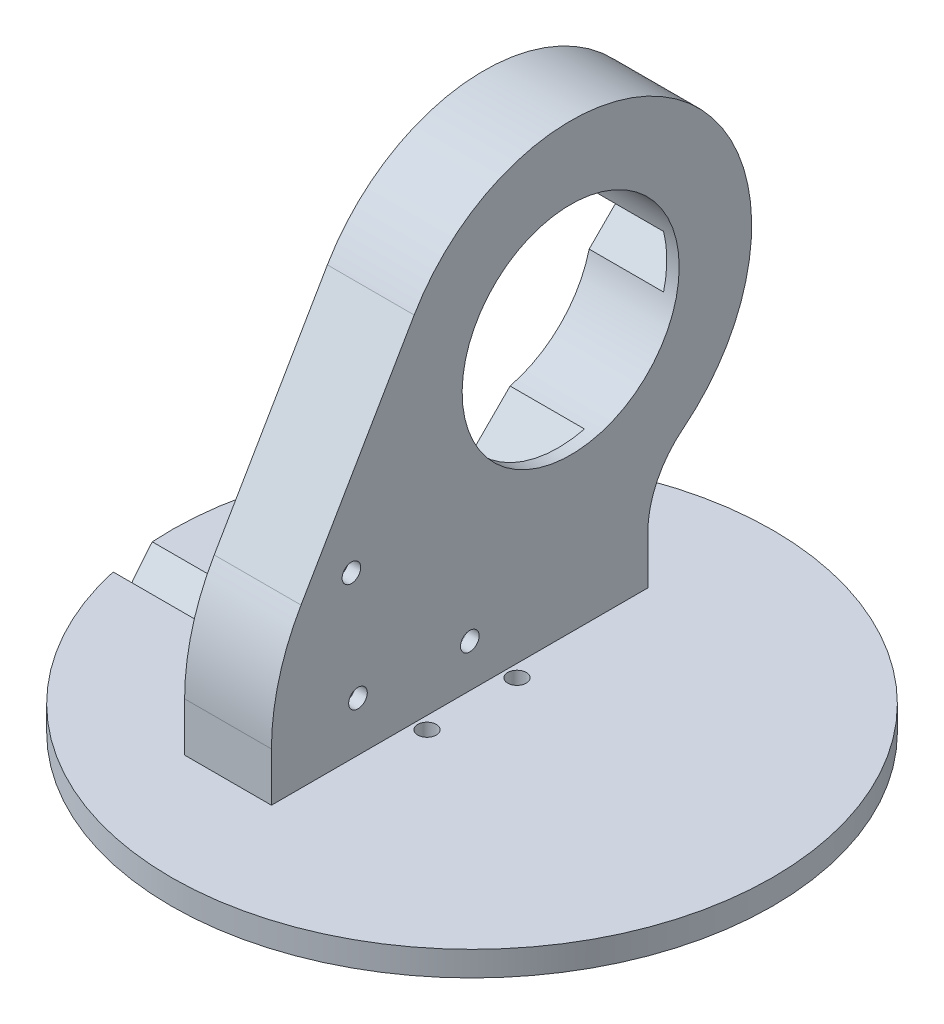
ISO-10303-21;
HEADER;
FILE_DESCRIPTION(('STEP AP214'),'2;1');
FILE_NAME('part.step','',(''),(''),'','','');
FILE_SCHEMA(('AUTOMOTIVE_DESIGN { 1 0 10303 214 1 1 1 1 }'));
ENDSEC;
DATA;
#1=APPLICATION_CONTEXT('core data for automotive mechanical design processes');
#2=APPLICATION_PROTOCOL_DEFINITION('international standard','automotive_design',2000,#1);
#3=PRODUCT_CONTEXT('',#1,'mechanical');
#4=PRODUCT('Part','Part','',(#3));
#5=PRODUCT_RELATED_PRODUCT_CATEGORY('part','',(#4));
#6=PRODUCT_DEFINITION_FORMATION('','',#4);
#7=PRODUCT_DEFINITION_CONTEXT('part definition',#1,'design');
#8=PRODUCT_DEFINITION('design','',#6,#7);
#9=PRODUCT_DEFINITION_SHAPE('','',#8);
#10=(LENGTH_UNIT() NAMED_UNIT(*) SI_UNIT(.MILLI.,.METRE.));
#11=(NAMED_UNIT(*) PLANE_ANGLE_UNIT() SI_UNIT($,.RADIAN.));
#12=(NAMED_UNIT(*) SI_UNIT($,.STERADIAN.) SOLID_ANGLE_UNIT());
#13=UNCERTAINTY_MEASURE_WITH_UNIT(LENGTH_MEASURE(1.E-05),#10,'distance_accuracy_value','');
#14=(GEOMETRIC_REPRESENTATION_CONTEXT(3) GLOBAL_UNCERTAINTY_ASSIGNED_CONTEXT((#13)) GLOBAL_UNIT_ASSIGNED_CONTEXT((#10,
#11,#12)) REPRESENTATION_CONTEXT('',''));
#15=CARTESIAN_POINT('',(0.,0.,0.));
#16=DIRECTION('',(0.,0.,1.));
#17=DIRECTION('',(1.,0.,0.));
#18=AXIS2_PLACEMENT_3D('',#15,#16,#17);
#19=CARTESIAN_POINT('',(0.,4.,0.));
#20=DIRECTION('',(0.,1.,0.));
#21=DIRECTION('',(0.,0.,1.));
#22=AXIS2_PLACEMENT_3D('',#19,#20,#21);
#23=PLANE('',#22);
#24=DIRECTION('',(-1.,0.,0.));
#25=VECTOR('',#24,1.);
#26=CARTESIAN_POINT('',(0.,4.,3.15679656440359));
#27=LINE('',#26,#25);
#28=CARTESIAN_POINT('',(-16.,4.,3.15679656440359));
#29=VERTEX_POINT('',#28);
#30=CARTESIAN_POINT('',(-48.3971552413049,4.,3.15679656440359));
#31=VERTEX_POINT('',#30);
#32=EDGE_CURVE('E236',#29,#31,#27,.T.);
#33=ORIENTED_EDGE('',*,*,#32,.F.);
#34=DIRECTION('',(0.,0.,-1.));
#35=VECTOR('',#34,1.);
#36=CARTESIAN_POINT('',(-16.,4.,30.34));
#37=LINE('',#36,#35);
#38=CARTESIAN_POINT('',(-16.,4.,-30.34));
#39=VERTEX_POINT('',#38);
#40=EDGE_CURVE('E285',#29,#39,#37,.T.);
#41=ORIENTED_EDGE('',*,*,#40,.T.);
#42=DIRECTION('',(-1.,0.,0.));
#43=VECTOR('',#42,1.);
#44=CARTESIAN_POINT('',(-2.,4.,-30.34));
#45=LINE('',#44,#43);
#46=CARTESIAN_POINT('',(-2.,4.,-30.34));
#47=VERTEX_POINT('',#46);
#48=EDGE_CURVE('E272',#47,#39,#45,.T.);
#49=ORIENTED_EDGE('',*,*,#48,.F.);
#50=DIRECTION('',(0.,0.,-1.));
#51=VECTOR('',#50,1.);
#52=CARTESIAN_POINT('',(-2.,4.,30.34));
#53=LINE('',#52,#51);
#54=CARTESIAN_POINT('',(-2.,4.,30.34));
#55=VERTEX_POINT('',#54);
#56=EDGE_CURVE('E270',#55,#47,#53,.T.);
#57=ORIENTED_EDGE('',*,*,#56,.F.);
#58=DIRECTION('',(-1.,0.,0.));
#59=VECTOR('',#58,1.);
#60=CARTESIAN_POINT('',(-2.,4.,30.34));
#61=LINE('',#60,#59);
#62=CARTESIAN_POINT('',(-16.,4.,30.34));
#63=VERTEX_POINT('',#62);
#64=EDGE_CURVE('E286',#55,#63,#61,.T.);
#65=ORIENTED_EDGE('',*,*,#64,.T.);
#66=CARTESIAN_POINT('',(-16.,4.,10.5206781186548));
#67=VERTEX_POINT('',#66);
#68=EDGE_CURVE('E256',#63,#67,#37,.T.);
#69=ORIENTED_EDGE('',*,*,#68,.T.);
#70=DIRECTION('',(1.,0.,0.));
#71=VECTOR('',#70,1.);
#72=CARTESIAN_POINT('',(0.,4.,10.5206781186548));
#73=LINE('',#72,#71);
#74=CARTESIAN_POINT('',(-47.3451722134756,4.,10.5206781186548));
#75=VERTEX_POINT('',#74);
#76=EDGE_CURVE('E241',#75,#67,#73,.T.);
#77=ORIENTED_EDGE('',*,*,#76,.F.);
#78=CARTESIAN_POINT('',(0.,4.,0.));
#79=DIRECTION('',(0.,1.,0.));
#80=DIRECTION('',(0.,0.,1.));
#81=AXIS2_PLACEMENT_3D('',#78,#79,#80);
#82=CIRCLE('',#81,48.5);
#83=EDGE_CURVE('E325',#75,#31,#82,.T.);
#84=ORIENTED_EDGE('',*,*,#83,.T.);
#85=EDGE_LOOP('',(#33,#41,#49,#57,#65,#69,#77,#84));
#86=FACE_BOUND('',#85,.T.);
#87=CARTESIAN_POINT('',(0.,4.,7.25));
#88=DIRECTION('',(0.,1.,0.));
#89=DIRECTION('',(0.,0.,1.));
#90=AXIS2_PLACEMENT_3D('',#87,#88,#89);
#91=CIRCLE('',#90,1.5);
#92=CARTESIAN_POINT('',(0.,4.,8.75));
#93=VERTEX_POINT('',#92);
#94=EDGE_CURVE('E314',#93,#93,#91,.T.);
#95=ORIENTED_EDGE('',*,*,#94,.F.);
#96=EDGE_LOOP('',(#95));
#97=FACE_BOUND('',#96,.T.);
#98=CARTESIAN_POINT('',(0.,4.,-7.25));
#99=DIRECTION('',(0.,1.,0.));
#100=DIRECTION('',(0.,0.,1.));
#101=AXIS2_PLACEMENT_3D('',#98,#99,#100);
#102=CIRCLE('',#101,1.5);
#103=CARTESIAN_POINT('',(0.,4.,-5.75));
#104=VERTEX_POINT('',#103);
#105=EDGE_CURVE('E319',#104,#104,#102,.T.);
#106=ORIENTED_EDGE('',*,*,#105,.F.);
#107=EDGE_LOOP('',(#106));
#108=FACE_BOUND('',#107,.T.);
#109=ADVANCED_FACE('F44',(#86,#97,#108),#23,.T.);
#110=CARTESIAN_POINT('',(0.,4.,-7.25));
#111=DIRECTION('',(0.,-1.,0.));
#112=DIRECTION('',(0.,0.,-1.));
#113=AXIS2_PLACEMENT_3D('',#110,#111,#112);
#114=CYLINDRICAL_SURFACE('',#113,1.5);
#115=ORIENTED_EDGE('',*,*,#105,.T.);
#116=EDGE_LOOP('',(#115));
#117=FACE_BOUND('',#116,.T.);
#118=CARTESIAN_POINT('',(0.,0.,-7.25));
#119=DIRECTION('',(0.,1.,0.));
#120=DIRECTION('',(0.,0.,1.));
#121=AXIS2_PLACEMENT_3D('',#118,#119,#120);
#122=CIRCLE('',#121,1.5);
#123=CARTESIAN_POINT('',(0.,0.,-5.75));
#124=VERTEX_POINT('',#123);
#125=EDGE_CURVE('E327',#124,#124,#122,.T.);
#126=ORIENTED_EDGE('',*,*,#125,.F.);
#127=EDGE_LOOP('',(#126));
#128=FACE_BOUND('',#127,.T.);
#129=ADVANCED_FACE('F464',(#117,#128),#114,.F.);
#130=CARTESIAN_POINT('',(0.,4.,7.25));
#131=DIRECTION('',(0.,-1.,0.));
#132=DIRECTION('',(0.,0.,-1.));
#133=AXIS2_PLACEMENT_3D('',#130,#131,#132);
#134=CYLINDRICAL_SURFACE('',#133,1.5);
#135=ORIENTED_EDGE('',*,*,#94,.T.);
#136=EDGE_LOOP('',(#135));
#137=FACE_BOUND('',#136,.T.);
#138=CARTESIAN_POINT('',(0.,0.,7.25));
#139=DIRECTION('',(0.,1.,0.));
#140=DIRECTION('',(0.,0.,1.));
#141=AXIS2_PLACEMENT_3D('',#138,#139,#140);
#142=CIRCLE('',#141,1.5);
#143=CARTESIAN_POINT('',(0.,0.,8.75));
#144=VERTEX_POINT('',#143);
#145=EDGE_CURVE('E315',#144,#144,#142,.T.);
#146=ORIENTED_EDGE('',*,*,#145,.F.);
#147=EDGE_LOOP('',(#146));
#148=FACE_BOUND('',#147,.T.);
#149=ADVANCED_FACE('F50',(#137,#148),#134,.F.);
#150=CARTESIAN_POINT('',(0.,4.,0.));
#151=DIRECTION('',(0.,-1.,0.));
#152=DIRECTION('',(0.,0.,-1.));
#153=AXIS2_PLACEMENT_3D('',#150,#151,#152);
#154=CYLINDRICAL_SURFACE('',#153,48.5);
#155=CARTESIAN_POINT('',(0.,-6.52067811865472,0.));
#156=DIRECTION('',(0.,-0.707106781186549,0.707106781186546));
#157=DIRECTION('',(0.,-0.707106781186546,-0.707106781186549));
#158=AXIS2_PLACEMENT_3D('',#155,#156,#157);
#159=ELLIPSE('',#158,68.589357775095,48.5);
#160=CARTESIAN_POINT('',(-48.0154315983265,0.318059222874422,6.83873734152916));
#161=VERTEX_POINT('',#160);
#162=EDGE_CURVE('E243',#75,#161,#159,.T.);
#163=ORIENTED_EDGE('',*,*,#162,.T.);
#164=CARTESIAN_POINT('',(0.,7.15679656440359,0.));
#165=DIRECTION('',(0.,-0.707106781186547,-0.707106781186548));
#166=DIRECTION('',(0.,-0.707106781186548,0.707106781186547));
#167=AXIS2_PLACEMENT_3D('',#164,#165,#166);
#168=ELLIPSE('',#167,68.5893577750951,48.5);
#169=EDGE_CURVE('E238',#161,#31,#168,.T.);
#170=ORIENTED_EDGE('',*,*,#169,.T.);
#171=ORIENTED_EDGE('',*,*,#83,.F.);
#172=EDGE_LOOP('',(#163,#170,#171));
#173=FACE_BOUND('',#172,.T.);
#174=CARTESIAN_POINT('',(0.,0.,0.));
#175=DIRECTION('',(0.,1.,0.));
#176=DIRECTION('',(0.,0.,1.));
#177=AXIS2_PLACEMENT_3D('',#174,#175,#176);
#178=CIRCLE('',#177,48.5);
#179=CARTESIAN_POINT('',(0.,0.,48.5));
#180=VERTEX_POINT('',#179);
#181=EDGE_CURVE('E316',#180,#180,#178,.T.);
#182=ORIENTED_EDGE('',*,*,#181,.T.);
#183=EDGE_LOOP('',(#182));
#184=FACE_BOUND('',#183,.T.);
#185=ADVANCED_FACE('F424',(#173,#184),#154,.T.);
#186=CARTESIAN_POINT('',(0.,0.,0.));
#187=DIRECTION('',(0.,1.,0.));
#188=DIRECTION('',(0.,0.,1.));
#189=AXIS2_PLACEMENT_3D('',#186,#187,#188);
#190=PLANE('',#189);
#191=CARTESIAN_POINT('',(0.,0.,0.));
#192=DIRECTION('',(0.,1.,0.));
#193=DIRECTION('',(0.,0.,1.));
#194=AXIS2_PLACEMENT_3D('',#191,#192,#193);
#195=CIRCLE('',#194,3.75);
#196=CARTESIAN_POINT('',(0.,0.,3.75));
#197=VERTEX_POINT('',#196);
#198=EDGE_CURVE('E307',#197,#197,#195,.T.);
#199=ORIENTED_EDGE('',*,*,#198,.T.);
#200=EDGE_LOOP('',(#199));
#201=FACE_BOUND('',#200,.T.);
#202=ORIENTED_EDGE('',*,*,#145,.T.);
#203=EDGE_LOOP('',(#202));
#204=FACE_BOUND('',#203,.T.);
#205=ORIENTED_EDGE('',*,*,#125,.T.);
#206=EDGE_LOOP('',(#205));
#207=FACE_BOUND('',#206,.T.);
#208=ORIENTED_EDGE('',*,*,#181,.F.);
#209=EDGE_LOOP('',(#208));
#210=FACE_BOUND('',#209,.T.);
#211=ADVANCED_FACE('F471',(#201,#204,#207,#210),#190,.F.);
#212=CARTESIAN_POINT('',(0.,0.,0.));
#213=DIRECTION('',(0.,1.,0.));
#214=DIRECTION('',(0.,0.,1.));
#215=AXIS2_PLACEMENT_3D('',#212,#213,#214);
#216=CYLINDRICAL_SURFACE('',#215,3.75);
#217=ORIENTED_EDGE('',*,*,#198,.F.);
#218=EDGE_LOOP('',(#217));
#219=FACE_BOUND('',#218,.T.);
#220=CARTESIAN_POINT('',(0.,1.5,0.));
#221=DIRECTION('',(0.,1.,0.));
#222=DIRECTION('',(0.,0.,1.));
#223=AXIS2_PLACEMENT_3D('',#220,#221,#222);
#224=CIRCLE('',#223,3.75);
#225=CARTESIAN_POINT('',(0.,1.5,3.75));
#226=VERTEX_POINT('',#225);
#227=EDGE_CURVE('E308',#226,#226,#224,.T.);
#228=ORIENTED_EDGE('',*,*,#227,.T.);
#229=EDGE_LOOP('',(#228));
#230=FACE_BOUND('',#229,.T.);
#231=ADVANCED_FACE('F475',(#219,#230),#216,.F.);
#232=CARTESIAN_POINT('',(0.,1.5,0.));
#233=DIRECTION('',(0.,1.,0.));
#234=DIRECTION('',(0.,0.,1.));
#235=AXIS2_PLACEMENT_3D('',#232,#233,#234);
#236=PLANE('',#235);
#237=ORIENTED_EDGE('',*,*,#227,.F.);
#238=EDGE_LOOP('',(#237));
#239=FACE_BOUND('',#238,.T.);
#240=ADVANCED_FACE('F509',(#239),#236,.F.);
#241=CARTESIAN_POINT('',(-2.,11.64,-45.34));
#242=DIRECTION('',(-1.,0.,0.));
#243=DIRECTION('',(0.,0.,1.));
#244=AXIS2_PLACEMENT_3D('',#241,#242,#243);
#245=PLANE('',#244);
#246=CARTESIAN_POINT('',(-2.,10.9246609406724,-1.64654403270961));
#247=DIRECTION('',(-1.,0.,0.));
#248=DIRECTION('',(0.,0.,1.));
#249=AXIS2_PLACEMENT_3D('',#246,#247,#248);
#250=CIRCLE('',#249,1.49999999999989);
#251=CARTESIAN_POINT('',(-2.,10.9246609406724,-0.146544032709713));
#252=VERTEX_POINT('',#251);
#253=EDGE_CURVE('E431',#252,#252,#250,.T.);
#254=ORIENTED_EDGE('',*,*,#253,.T.);
#255=EDGE_LOOP('',(#254));
#256=FACE_BOUND('',#255,.T.);
#257=CARTESIAN_POINT('',(-2.,11.9853211124524,16.3846788875475));
#258=DIRECTION('',(-1.,0.,0.));
#259=DIRECTION('',(0.,0.,1.));
#260=AXIS2_PLACEMENT_3D('',#257,#258,#259);
#261=CIRCLE('',#260,1.49999999999997);
#262=CARTESIAN_POINT('',(-2.,11.9853211124524,17.8846788875475));
#263=VERTEX_POINT('',#262);
#264=EDGE_CURVE('E435',#263,#263,#261,.T.);
#265=ORIENTED_EDGE('',*,*,#264,.T.);
#266=EDGE_LOOP('',(#265));
#267=FACE_BOUND('',#266,.T.);
#268=CARTESIAN_POINT('',(-2.,30.0165440327093,17.4453390593273));
#269=DIRECTION('',(-1.,0.,0.));
#270=DIRECTION('',(0.,0.,1.));
#271=AXIS2_PLACEMENT_3D('',#268,#269,#270);
#272=CIRCLE('',#271,1.5);
#273=CARTESIAN_POINT('',(-2.,30.0165440327093,18.9453390593273));
#274=VERTEX_POINT('',#273);
#275=EDGE_CURVE('E202',#274,#274,#272,.T.);
#276=ORIENTED_EDGE('',*,*,#275,.T.);
#277=EDGE_LOOP('',(#276));
#278=FACE_BOUND('',#277,.T.);
#279=DIRECTION('',(0.,1.,0.));
#280=VECTOR('',#279,1.);
#281=CARTESIAN_POINT('',(-2.,4.,-30.34));
#282=LINE('',#281,#280);
#283=CARTESIAN_POINT('',(-2.,11.64,-30.34));
#284=VERTEX_POINT('',#283);
#285=EDGE_CURVE('E253',#47,#284,#282,.T.);
#286=ORIENTED_EDGE('',*,*,#285,.T.);
#287=CARTESIAN_POINT('',(-2.,11.64,-45.34));
#288=DIRECTION('',(-1.,0.,0.));
#289=DIRECTION('',(0.,0.,1.));
#290=AXIS2_PLACEMENT_3D('',#287,#288,#289);
#291=CIRCLE('',#290,15.);
#292=CARTESIAN_POINT('',(-2.,23.3995858768625,-36.0280646477385));
#293=VERTEX_POINT('',#292);
#294=EDGE_CURVE('E259',#284,#293,#291,.T.);
#295=ORIENTED_EDGE('',*,*,#294,.T.);
#296=CARTESIAN_POINT('',(-2.,46.28,-17.91));
#297=DIRECTION('',(1.,0.,0.));
#298=DIRECTION('',(0.,0.,-1.));
#299=AXIS2_PLACEMENT_3D('',#296,#297,#298);
#300=CIRCLE('',#299,29.1852294324699);
#301=CARTESIAN_POINT('',(-2.,60.9494116973824,7.32065551028364));
#302=VERTEX_POINT('',#301);
#303=EDGE_CURVE('E261',#293,#302,#300,.T.);
#304=ORIENTED_EDGE('',*,*,#303,.T.);
#305=DIRECTION('',(0.,-0.864500845150575,0.502631364653998));
#306=VECTOR('',#305,1.);
#307=CARTESIAN_POINT('',(-2.,29.5677029767604,25.5663647746548));
#308=LINE('',#307,#306);
#309=CARTESIAN_POINT('',(-2.,29.5677029767604,25.5663647746548));
#310=VERTEX_POINT('',#309);
#311=EDGE_CURVE('E264',#302,#310,#308,.T.);
#312=ORIENTED_EDGE('',*,*,#311,.T.);
#313=CARTESIAN_POINT('',(-2.,11.86,-4.89));
#314=DIRECTION('',(1.,0.,0.));
#315=DIRECTION('',(0.,0.,1.));
#316=AXIS2_PLACEMENT_3D('',#313,#314,#315);
#317=CIRCLE('',#316,35.23);
#318=CARTESIAN_POINT('',(-2.,11.86,30.34));
#319=VERTEX_POINT('',#318);
#320=EDGE_CURVE('E265',#310,#319,#317,.T.);
#321=ORIENTED_EDGE('',*,*,#320,.T.);
#322=DIRECTION('',(0.,-1.,0.));
#323=VECTOR('',#322,1.);
#324=CARTESIAN_POINT('',(-2.,4.,30.34));
#325=LINE('',#324,#323);
#326=EDGE_CURVE('E269',#319,#55,#325,.T.);
#327=ORIENTED_EDGE('',*,*,#326,.T.);
#328=ORIENTED_EDGE('',*,*,#56,.T.);
#329=EDGE_LOOP('',(#286,#295,#304,#312,#321,#327,#328));
#330=FACE_BOUND('',#329,.T.);
#331=CARTESIAN_POINT('',(-2.,46.28,-17.91));
#332=DIRECTION('',(1.,0.,0.));
#333=DIRECTION('',(0.,0.,-1.));
#334=AXIS2_PLACEMENT_3D('',#331,#332,#333);
#335=CIRCLE('',#334,17.5);
#336=CARTESIAN_POINT('',(-2.,46.28,-35.41));
#337=VERTEX_POINT('',#336);
#338=EDGE_CURVE('E250',#337,#337,#335,.T.);
#339=ORIENTED_EDGE('',*,*,#338,.F.);
#340=EDGE_LOOP('',(#339));
#341=FACE_BOUND('',#340,.T.);
#342=ADVANCED_FACE('F443',(#256,#267,#278,#330,#341),#245,.F.);
#343=CARTESIAN_POINT('',(-16.,11.64,-45.34));
#344=DIRECTION('',(-1.,0.,0.));
#345=DIRECTION('',(0.,0.,1.));
#346=AXIS2_PLACEMENT_3D('',#343,#344,#345);
#347=PLANE('',#346);
#348=DIRECTION('',(0.,-0.707106781186548,0.707106781186547));
#349=VECTOR('',#348,1.);
#350=CARTESIAN_POINT('',(-16.,32.0683982822018,-24.9116017177982));
#351=LINE('',#350,#349);
#352=CARTESIAN_POINT('',(-16.,29.2996238902108,-22.1428273258072));
#353=VERTEX_POINT('',#352);
#354=EDGE_CURVE('E232',#353,#29,#351,.T.);
#355=ORIENTED_EDGE('',*,*,#354,.F.);
#356=CARTESIAN_POINT('',(-16.,46.28,-17.91));
#357=DIRECTION('',(1.,0.,0.));
#358=DIRECTION('',(0.,0.,-1.));
#359=AXIS2_PLACEMENT_3D('',#356,#357,#358);
#360=CIRCLE('',#359,17.5);
#361=CARTESIAN_POINT('',(-16.,42.0471726741928,-34.8903761097892));
#362=VERTEX_POINT('',#361);
#363=EDGE_CURVE('E246',#353,#362,#360,.T.);
#364=ORIENTED_EDGE('',*,*,#363,.T.);
#365=CARTESIAN_POINT('',(-16.,46.28,-39.1232034355964));
#366=VERTEX_POINT('',#365);
#367=EDGE_CURVE('E231',#366,#362,#351,.T.);
#368=ORIENTED_EDGE('',*,*,#367,.F.);
#369=DIRECTION('',(0.,-0.707106781186547,-0.707106781186548));
#370=VECTOR('',#369,1.);
#371=CARTESIAN_POINT('',(-16.,25.8516017177982,-59.5516017177982));
#372=LINE('',#371,#370);
#373=CARTESIAN_POINT('',(-16.,50.5128273258072,-34.8903761097892));
#374=VERTEX_POINT('',#373);
#375=EDGE_CURVE('E186',#374,#366,#372,.T.);
#376=ORIENTED_EDGE('',*,*,#375,.F.);
#377=CARTESIAN_POINT('',(-16.,63.2603761097892,-22.1428273258072));
#378=VERTEX_POINT('',#377);
#379=EDGE_CURVE('E252',#374,#378,#360,.T.);
#380=ORIENTED_EDGE('',*,*,#379,.T.);
#381=CARTESIAN_POINT('',(-16.,67.4932034355964,-17.91));
#382=VERTEX_POINT('',#381);
#383=EDGE_CURVE('E225',#382,#378,#372,.T.);
#384=ORIENTED_EDGE('',*,*,#383,.F.);
#385=DIRECTION('',(0.,0.707106781186548,-0.707106781186548));
#386=VECTOR('',#385,1.);
#387=CARTESIAN_POINT('',(-16.,53.2816017177982,-3.69839828220178));
#388=LINE('',#387,#386);
#389=CARTESIAN_POINT('',(-16.,63.2603761097892,-13.6771726741928));
#390=VERTEX_POINT('',#389);
#391=EDGE_CURVE('E235',#390,#382,#388,.T.);
#392=ORIENTED_EDGE('',*,*,#391,.F.);
#393=CARTESIAN_POINT('',(-16.,50.5128273258072,-0.929623890210798));
#394=VERTEX_POINT('',#393);
#395=EDGE_CURVE('E251',#390,#394,#360,.T.);
#396=ORIENTED_EDGE('',*,*,#395,.T.);
#397=CARTESIAN_POINT('',(-16.,21.5312626584708,28.0519407771256));
#398=VERTEX_POINT('',#397);
#399=EDGE_CURVE('E229',#398,#394,#388,.T.);
#400=ORIENTED_EDGE('',*,*,#399,.F.);
#401=DIRECTION('',(0.,0.707106781186546,0.707106781186549));
#402=VECTOR('',#401,1.);
#403=CARTESIAN_POINT('',(-16.,-20.1103390593274,-13.5896609406727));
#404=LINE('',#403,#402);
#405=EDGE_CURVE('E11',#67,#398,#404,.T.);
#406=ORIENTED_EDGE('',*,*,#405,.F.);
#407=ORIENTED_EDGE('',*,*,#68,.F.);
#408=DIRECTION('',(0.,-1.,0.));
#409=VECTOR('',#408,1.);
#410=CARTESIAN_POINT('',(-16.,4.,30.34));
#411=LINE('',#410,#409);
#412=CARTESIAN_POINT('',(-16.,11.86,30.34));
#413=VERTEX_POINT('',#412);
#414=EDGE_CURVE('E282',#413,#63,#411,.T.);
#415=ORIENTED_EDGE('',*,*,#414,.F.);
#416=CARTESIAN_POINT('',(-16.,11.86,-4.89));
#417=DIRECTION('',(1.,0.,0.));
#418=DIRECTION('',(0.,0.,1.));
#419=AXIS2_PLACEMENT_3D('',#416,#417,#418);
#420=CIRCLE('',#419,35.23);
#421=CARTESIAN_POINT('',(-16.,29.5677029767604,25.5663647746548));
#422=VERTEX_POINT('',#421);
#423=EDGE_CURVE('E278',#422,#413,#420,.T.);
#424=ORIENTED_EDGE('',*,*,#423,.F.);
#425=DIRECTION('',(0.,-0.864500845150575,0.502631364653998));
#426=VECTOR('',#425,1.);
#427=CARTESIAN_POINT('',(-16.,29.5677029767604,25.5663647746548));
#428=LINE('',#427,#426);
#429=CARTESIAN_POINT('',(-16.,60.9494116973824,7.32065551028364));
#430=VERTEX_POINT('',#429);
#431=EDGE_CURVE('E279',#430,#422,#428,.T.);
#432=ORIENTED_EDGE('',*,*,#431,.F.);
#433=CARTESIAN_POINT('',(-16.,46.28,-17.91));
#434=DIRECTION('',(1.,0.,0.));
#435=DIRECTION('',(0.,0.,-1.));
#436=AXIS2_PLACEMENT_3D('',#433,#434,#435);
#437=CIRCLE('',#436,29.1852294324699);
#438=CARTESIAN_POINT('',(-16.,23.3995858768625,-36.0280646477385));
#439=VERTEX_POINT('',#438);
#440=EDGE_CURVE('E277',#439,#430,#437,.T.);
#441=ORIENTED_EDGE('',*,*,#440,.F.);
#442=CARTESIAN_POINT('',(-16.,11.64,-45.34));
#443=DIRECTION('',(-1.,0.,0.));
#444=DIRECTION('',(0.,0.,1.));
#445=AXIS2_PLACEMENT_3D('',#442,#443,#444);
#446=CIRCLE('',#445,15.);
#447=CARTESIAN_POINT('',(-16.,11.64,-30.34));
#448=VERTEX_POINT('',#447);
#449=EDGE_CURVE('E274',#448,#439,#446,.T.);
#450=ORIENTED_EDGE('',*,*,#449,.F.);
#451=DIRECTION('',(0.,1.,0.));
#452=VECTOR('',#451,1.);
#453=CARTESIAN_POINT('',(-16.,4.,-30.34));
#454=LINE('',#453,#452);
#455=EDGE_CURVE('E249',#39,#448,#454,.T.);
#456=ORIENTED_EDGE('',*,*,#455,.F.);
#457=ORIENTED_EDGE('',*,*,#40,.F.);
#458=EDGE_LOOP('',(#355,#364,#368,#376,#380,#384,#392,#396,#400,#406,#407,#415,#424,#432,#441,
#450,#456,#457));
#459=FACE_BOUND('',#458,.T.);
#460=ADVANCED_FACE('F356',(#459),#347,.T.);
#461=CARTESIAN_POINT('',(-2.,4.,-30.34));
#462=DIRECTION('',(0.,0.,1.));
#463=DIRECTION('',(1.,0.,0.));
#464=AXIS2_PLACEMENT_3D('',#461,#462,#463);
#465=PLANE('',#464);
#466=ORIENTED_EDGE('',*,*,#455,.T.);
#467=DIRECTION('',(-1.,0.,0.));
#468=VECTOR('',#467,1.);
#469=CARTESIAN_POINT('',(-2.,11.64,-30.34));
#470=LINE('',#469,#468);
#471=EDGE_CURVE('E304',#284,#448,#470,.T.);
#472=ORIENTED_EDGE('',*,*,#471,.F.);
#473=ORIENTED_EDGE('',*,*,#285,.F.);
#474=ORIENTED_EDGE('',*,*,#48,.T.);
#475=EDGE_LOOP('',(#466,#472,#473,#474));
#476=FACE_BOUND('',#475,.T.);
#477=ADVANCED_FACE('F416',(#476),#465,.F.);
#478=CARTESIAN_POINT('',(-2.,11.64,-45.34));
#479=DIRECTION('',(-1.,0.,0.));
#480=DIRECTION('',(0.,0.,1.));
#481=AXIS2_PLACEMENT_3D('',#478,#479,#480);
#482=CYLINDRICAL_SURFACE('',#481,15.);
#483=ORIENTED_EDGE('',*,*,#449,.T.);
#484=DIRECTION('',(-1.,0.,0.));
#485=VECTOR('',#484,1.);
#486=CARTESIAN_POINT('',(-2.,23.3995858768625,-36.0280646477385));
#487=LINE('',#486,#485);
#488=EDGE_CURVE('E305',#293,#439,#487,.T.);
#489=ORIENTED_EDGE('',*,*,#488,.F.);
#490=ORIENTED_EDGE('',*,*,#294,.F.);
#491=ORIENTED_EDGE('',*,*,#471,.T.);
#492=EDGE_LOOP('',(#483,#489,#490,#491));
#493=FACE_BOUND('',#492,.T.);
#494=ADVANCED_FACE('F419',(#493),#482,.F.);
#495=CARTESIAN_POINT('',(-2.,46.28,-17.91));
#496=DIRECTION('',(-1.,0.,0.));
#497=DIRECTION('',(0.,0.,1.));
#498=AXIS2_PLACEMENT_3D('',#495,#496,#497);
#499=CYLINDRICAL_SURFACE('',#498,29.1852294324699);
#500=ORIENTED_EDGE('',*,*,#440,.T.);
#501=DIRECTION('',(-1.,0.,0.));
#502=VECTOR('',#501,1.);
#503=CARTESIAN_POINT('',(-2.,60.9494116973824,7.32065551028364));
#504=LINE('',#503,#502);
#505=EDGE_CURVE('E299',#302,#430,#504,.T.);
#506=ORIENTED_EDGE('',*,*,#505,.F.);
#507=ORIENTED_EDGE('',*,*,#303,.F.);
#508=ORIENTED_EDGE('',*,*,#488,.T.);
#509=EDGE_LOOP('',(#500,#506,#507,#508));
#510=FACE_BOUND('',#509,.T.);
#511=ADVANCED_FACE('F412',(#510),#499,.T.);
#512=CARTESIAN_POINT('',(-2.,29.5677029767604,25.5663647746548));
#513=DIRECTION('',(0.,-0.502631364653998,-0.864500845150575));
#514=DIRECTION('',(0.,0.864500845150575,-0.502631364653998));
#515=AXIS2_PLACEMENT_3D('',#512,#513,#514);
#516=PLANE('',#515);
#517=ORIENTED_EDGE('',*,*,#431,.T.);
#518=DIRECTION('',(-1.,0.,0.));
#519=VECTOR('',#518,1.);
#520=CARTESIAN_POINT('',(-2.,29.5677029767604,25.5663647746548));
#521=LINE('',#520,#519);
#522=EDGE_CURVE('E298',#310,#422,#521,.T.);
#523=ORIENTED_EDGE('',*,*,#522,.F.);
#524=ORIENTED_EDGE('',*,*,#311,.F.);
#525=ORIENTED_EDGE('',*,*,#505,.T.);
#526=EDGE_LOOP('',(#517,#523,#524,#525));
#527=FACE_BOUND('',#526,.T.);
#528=ADVANCED_FACE('F409',(#527),#516,.F.);
#529=CARTESIAN_POINT('',(-2.,11.86,-4.89));
#530=DIRECTION('',(-1.,0.,0.));
#531=DIRECTION('',(0.,0.,1.));
#532=AXIS2_PLACEMENT_3D('',#529,#530,#531);
#533=CYLINDRICAL_SURFACE('',#532,35.23);
#534=ORIENTED_EDGE('',*,*,#423,.T.);
#535=DIRECTION('',(-1.,0.,0.));
#536=VECTOR('',#535,1.);
#537=CARTESIAN_POINT('',(-2.,11.86,30.34));
#538=LINE('',#537,#536);
#539=EDGE_CURVE('E291',#319,#413,#538,.T.);
#540=ORIENTED_EDGE('',*,*,#539,.F.);
#541=ORIENTED_EDGE('',*,*,#320,.F.);
#542=ORIENTED_EDGE('',*,*,#522,.T.);
#543=EDGE_LOOP('',(#534,#540,#541,#542));
#544=FACE_BOUND('',#543,.T.);
#545=ADVANCED_FACE('F401',(#544),#533,.T.);
#546=CARTESIAN_POINT('',(-2.,4.,30.34));
#547=DIRECTION('',(0.,0.,-1.));
#548=DIRECTION('',(-1.,0.,0.));
#549=AXIS2_PLACEMENT_3D('',#546,#547,#548);
#550=PLANE('',#549);
#551=ORIENTED_EDGE('',*,*,#414,.T.);
#552=ORIENTED_EDGE('',*,*,#64,.F.);
#553=ORIENTED_EDGE('',*,*,#326,.F.);
#554=ORIENTED_EDGE('',*,*,#539,.T.);
#555=EDGE_LOOP('',(#551,#552,#553,#554));
#556=FACE_BOUND('',#555,.T.);
#557=ADVANCED_FACE('F399',(#556),#550,.F.);
#558=CARTESIAN_POINT('',(-2.,46.28,-17.91));
#559=DIRECTION('',(-1.,0.,0.));
#560=DIRECTION('',(0.,0.,1.));
#561=AXIS2_PLACEMENT_3D('',#558,#559,#560);
#562=CYLINDRICAL_SURFACE('',#561,17.5);
#563=DIRECTION('',(-1.,0.,0.));
#564=VECTOR('',#563,1.);
#565=CARTESIAN_POINT('',(-2.,63.2603761097892,-13.6771726741928));
#566=LINE('',#565,#564);
#567=CARTESIAN_POINT('',(-4.,63.2603761097892,-13.6771726741928));
#568=VERTEX_POINT('',#567);
#569=EDGE_CURVE('E52',#568,#390,#566,.T.);
#570=ORIENTED_EDGE('',*,*,#569,.F.);
#571=CARTESIAN_POINT('',(-4.,46.28,-17.91));
#572=DIRECTION('',(1.,0.,0.));
#573=DIRECTION('',(0.,0.,-1.));
#574=AXIS2_PLACEMENT_3D('',#571,#572,#573);
#575=CIRCLE('',#574,17.5);
#576=CARTESIAN_POINT('',(-4.,63.2603761097892,-22.1428273258072));
#577=VERTEX_POINT('',#576);
#578=EDGE_CURVE('E335',#577,#568,#575,.T.);
#579=ORIENTED_EDGE('',*,*,#578,.F.);
#580=DIRECTION('',(-1.,0.,0.));
#581=VECTOR('',#580,1.);
#582=CARTESIAN_POINT('',(-2.,63.2603761097892,-22.1428273258072));
#583=LINE('',#582,#581);
#584=EDGE_CURVE('E344',#378,#577,#583,.F.);
#585=ORIENTED_EDGE('',*,*,#584,.F.);
#586=ORIENTED_EDGE('',*,*,#379,.F.);
#587=DIRECTION('',(-1.,0.,0.));
#588=VECTOR('',#587,1.);
#589=CARTESIAN_POINT('',(-2.,50.5128273258072,-34.8903761097892));
#590=LINE('',#589,#588);
#591=CARTESIAN_POINT('',(-4.,50.5128273258072,-34.8903761097892));
#592=VERTEX_POINT('',#591);
#593=EDGE_CURVE('E332',#592,#374,#590,.T.);
#594=ORIENTED_EDGE('',*,*,#593,.F.);
#595=CARTESIAN_POINT('',(-4.,42.0471726741928,-34.8903761097892));
#596=VERTEX_POINT('',#595);
#597=EDGE_CURVE('E210',#596,#592,#575,.T.);
#598=ORIENTED_EDGE('',*,*,#597,.F.);
#599=DIRECTION('',(-1.,0.,0.));
#600=VECTOR('',#599,1.);
#601=CARTESIAN_POINT('',(-2.,42.0471726741928,-34.8903761097892));
#602=LINE('',#601,#600);
#603=EDGE_CURVE('E198',#362,#596,#602,.F.);
#604=ORIENTED_EDGE('',*,*,#603,.F.);
#605=ORIENTED_EDGE('',*,*,#363,.F.);
#606=DIRECTION('',(-1.,0.,0.));
#607=VECTOR('',#606,1.);
#608=CARTESIAN_POINT('',(-2.,29.2996238902108,-22.1428273258072));
#609=LINE('',#608,#607);
#610=CARTESIAN_POINT('',(-4.,29.2996238902108,-22.1428273258072));
#611=VERTEX_POINT('',#610);
#612=EDGE_CURVE('E342',#611,#353,#609,.T.);
#613=ORIENTED_EDGE('',*,*,#612,.F.);
#614=CARTESIAN_POINT('',(-4.,50.5128273258072,-0.929623890210797));
#615=VERTEX_POINT('',#614);
#616=EDGE_CURVE('E331',#615,#611,#575,.T.);
#617=ORIENTED_EDGE('',*,*,#616,.F.);
#618=DIRECTION('',(-1.,0.,0.));
#619=VECTOR('',#618,1.);
#620=CARTESIAN_POINT('',(-2.,50.5128273258072,-0.929623890210798));
#621=LINE('',#620,#619);
#622=EDGE_CURVE('E336',#394,#615,#621,.F.);
#623=ORIENTED_EDGE('',*,*,#622,.F.);
#624=ORIENTED_EDGE('',*,*,#395,.F.);
#625=EDGE_LOOP('',(#570,#579,#585,#586,#594,#598,#604,#605,#613,#617,#623,#624));
#626=FACE_BOUND('',#625,.T.);
#627=ORIENTED_EDGE('',*,*,#338,.T.);
#628=EDGE_LOOP('',(#627));
#629=FACE_BOUND('',#628,.T.);
#630=ADVANCED_FACE('F363',(#626,#629),#562,.F.);
#631=CARTESIAN_POINT('',(-4.,0.,0.));
#632=DIRECTION('',(1.,0.,0.));
#633=DIRECTION('',(0.,0.,-1.));
#634=AXIS2_PLACEMENT_3D('',#631,#632,#633);
#635=PLANE('',#634);
#636=ORIENTED_EDGE('',*,*,#597,.T.);
#637=DIRECTION('',(0.,0.707106781186547,0.707106781186548));
#638=VECTOR('',#637,1.);
#639=CARTESIAN_POINT('',(-4.,42.7016017177982,-42.7016017177982));
#640=LINE('',#639,#638);
#641=CARTESIAN_POINT('',(-4.,46.28,-39.1232034355964));
#642=VERTEX_POINT('',#641);
#643=EDGE_CURVE('E187',#642,#592,#640,.T.);
#644=ORIENTED_EDGE('',*,*,#643,.F.);
#645=DIRECTION('',(0.,0.707106781186548,-0.707106781186547));
#646=VECTOR('',#645,1.);
#647=CARTESIAN_POINT('',(-4.,3.57839828220179,3.5783982822018));
#648=LINE('',#647,#646);
#649=EDGE_CURVE('E196',#596,#642,#648,.T.);
#650=ORIENTED_EDGE('',*,*,#649,.F.);
#651=EDGE_LOOP('',(#636,#644,#650));
#652=FACE_BOUND('',#651,.T.);
#653=ADVANCED_FACE('F207',(#652),#635,.F.);
#654=CARTESIAN_POINT('',(-48.5,42.7016017177982,-42.7016017177982));
#655=DIRECTION('',(0.,0.707106781186548,-0.707106781186547));
#656=DIRECTION('',(0.,0.707106781186547,0.707106781186548));
#657=AXIS2_PLACEMENT_3D('',#654,#655,#656);
#658=PLANE('',#657);
#659=ORIENTED_EDGE('',*,*,#375,.T.);
#660=DIRECTION('',(1.,0.,0.));
#661=VECTOR('',#660,1.);
#662=CARTESIAN_POINT('',(-48.5,46.28,-39.1232034355964));
#663=LINE('',#662,#661);
#664=EDGE_CURVE('E185',#366,#642,#663,.T.);
#665=ORIENTED_EDGE('',*,*,#664,.T.);
#666=ORIENTED_EDGE('',*,*,#643,.T.);
#667=ORIENTED_EDGE('',*,*,#593,.T.);
#668=EDGE_LOOP('',(#659,#665,#666,#667));
#669=FACE_BOUND('',#668,.T.);
#670=ADVANCED_FACE('F183',(#669),#658,.F.);
#671=CARTESIAN_POINT('',(-48.5,3.57839828220179,3.5783982822018));
#672=DIRECTION('',(0.,-0.707106781186547,-0.707106781186548));
#673=DIRECTION('',(0.,0.707106781186548,-0.707106781186547));
#674=AXIS2_PLACEMENT_3D('',#671,#672,#673);
#675=PLANE('',#674);
#676=ORIENTED_EDGE('',*,*,#367,.T.);
#677=ORIENTED_EDGE('',*,*,#603,.T.);
#678=ORIENTED_EDGE('',*,*,#649,.T.);
#679=ORIENTED_EDGE('',*,*,#664,.F.);
#680=EDGE_LOOP('',(#676,#677,#678,#679));
#681=FACE_BOUND('',#680,.T.);
#682=ADVANCED_FACE('F197',(#681),#675,.F.);
#683=CARTESIAN_POINT('',(-4.,9.86400076889281,-2.70720420448922));
#684=VERTEX_POINT('',#683);
#685=EDGE_CURVE('E204',#684,#611,#648,.T.);
#686=ORIENTED_EDGE('',*,*,#685,.F.);
#687=CARTESIAN_POINT('',(-4.,10.9246609406724,-1.64654403270961));
#688=DIRECTION('',(1.,0.,0.));
#689=DIRECTION('',(0.,0.,-1.));
#690=AXIS2_PLACEMENT_3D('',#687,#688,#689);
#691=CIRCLE('',#690,1.49999999999989);
#692=EDGE_CURVE('E64',#684,#684,#691,.T.);
#693=ORIENTED_EDGE('',*,*,#692,.T.);
#694=CARTESIAN_POINT('',(-4.,0.318059222874422,6.83873734152916));
#695=VERTEX_POINT('',#694);
#696=EDGE_CURVE('E201',#695,#684,#648,.T.);
#697=ORIENTED_EDGE('',*,*,#696,.F.);
#698=DIRECTION('',(0.,-0.707106781186546,-0.707106781186549));
#699=VECTOR('',#698,1.);
#700=CARTESIAN_POINT('',(-4.,-3.26033905932737,3.26033905932736));
#701=LINE('',#700,#699);
#702=CARTESIAN_POINT('',(-4.,10.9246609406725,17.4453390593273));
#703=VERTEX_POINT('',#702);
#704=EDGE_CURVE('E219',#703,#695,#701,.T.);
#705=ORIENTED_EDGE('',*,*,#704,.F.);
#706=CARTESIAN_POINT('',(-4.,11.9853211124524,16.3846788875475));
#707=DIRECTION('',(1.,0.,0.));
#708=DIRECTION('',(0.,0.,-1.));
#709=AXIS2_PLACEMENT_3D('',#706,#707,#708);
#710=CIRCLE('',#709,1.49999999999997);
#711=EDGE_CURVE('E440',#703,#703,#710,.T.);
#712=ORIENTED_EDGE('',*,*,#711,.T.);
#713=CARTESIAN_POINT('',(-4.,21.5312626584708,28.0519407771256));
#714=VERTEX_POINT('',#713);
#715=EDGE_CURVE('E194',#714,#703,#701,.T.);
#716=ORIENTED_EDGE('',*,*,#715,.F.);
#717=DIRECTION('',(0.,-0.707106781186548,0.707106781186548));
#718=VECTOR('',#717,1.);
#719=CARTESIAN_POINT('',(-4.,24.7916017177982,24.7916017177982));
#720=LINE('',#719,#718);
#721=CARTESIAN_POINT('',(-4.,31.0772042044892,18.5059992311072));
#722=VERTEX_POINT('',#721);
#723=EDGE_CURVE('E206',#722,#714,#720,.T.);
#724=ORIENTED_EDGE('',*,*,#723,.F.);
#725=CARTESIAN_POINT('',(-4.,30.0165440327093,17.4453390593273));
#726=DIRECTION('',(1.,0.,0.));
#727=DIRECTION('',(0.,0.,-1.));
#728=AXIS2_PLACEMENT_3D('',#725,#726,#727);
#729=CIRCLE('',#728,1.5);
#730=EDGE_CURVE('E59',#722,#722,#729,.T.);
#731=ORIENTED_EDGE('',*,*,#730,.T.);
#732=EDGE_CURVE('E212',#615,#722,#720,.T.);
#733=ORIENTED_EDGE('',*,*,#732,.F.);
#734=ORIENTED_EDGE('',*,*,#616,.T.);
#735=EDGE_LOOP('',(#686,#693,#697,#705,#712,#716,#724,#731,#733,#734));
#736=FACE_BOUND('',#735,.T.);
#737=ADVANCED_FACE('F380',(#736),#635,.F.);
#738=CARTESIAN_POINT('',(-48.5,24.7916017177982,24.7916017177982));
#739=DIRECTION('',(0.,0.707106781186548,0.707106781186548));
#740=DIRECTION('',(0.,-0.707106781186548,0.707106781186548));
#741=AXIS2_PLACEMENT_3D('',#738,#739,#740);
#742=PLANE('',#741);
#743=ORIENTED_EDGE('',*,*,#732,.T.);
#744=ORIENTED_EDGE('',*,*,#723,.T.);
#745=DIRECTION('',(1.,0.,0.));
#746=VECTOR('',#745,1.);
#747=CARTESIAN_POINT('',(-48.5,21.5312626584708,28.0519407771256));
#748=LINE('',#747,#746);
#749=EDGE_CURVE('E221',#398,#714,#748,.T.);
#750=ORIENTED_EDGE('',*,*,#749,.F.);
#751=ORIENTED_EDGE('',*,*,#399,.T.);
#752=ORIENTED_EDGE('',*,*,#622,.T.);
#753=EDGE_LOOP('',(#743,#744,#750,#751,#752));
#754=FACE_BOUND('',#753,.T.);
#755=ADVANCED_FACE('F385',(#754),#742,.F.);
#756=ORIENTED_EDGE('',*,*,#696,.T.);
#757=ORIENTED_EDGE('',*,*,#685,.T.);
#758=ORIENTED_EDGE('',*,*,#612,.T.);
#759=ORIENTED_EDGE('',*,*,#354,.T.);
#760=ORIENTED_EDGE('',*,*,#32,.T.);
#761=ORIENTED_EDGE('',*,*,#169,.F.);
#762=DIRECTION('',(1.,0.,0.));
#763=VECTOR('',#762,1.);
#764=CARTESIAN_POINT('',(-48.5,0.318059222874422,6.83873734152916));
#765=LINE('',#764,#763);
#766=EDGE_CURVE('E223',#161,#695,#765,.T.);
#767=ORIENTED_EDGE('',*,*,#766,.T.);
#768=EDGE_LOOP('',(#756,#757,#758,#759,#760,#761,#767));
#769=FACE_BOUND('',#768,.T.);
#770=ADVANCED_FACE('F422',(#769),#675,.F.);
#771=CARTESIAN_POINT('',(-48.5,-3.26033905932737,3.26033905932736));
#772=DIRECTION('',(0.,-0.707106781186549,0.707106781186546));
#773=DIRECTION('',(0.,-0.707106781186546,-0.707106781186549));
#774=AXIS2_PLACEMENT_3D('',#771,#772,#773);
#775=PLANE('',#774);
#776=ORIENTED_EDGE('',*,*,#715,.T.);
#777=ORIENTED_EDGE('',*,*,#704,.T.);
#778=ORIENTED_EDGE('',*,*,#766,.F.);
#779=ORIENTED_EDGE('',*,*,#162,.F.);
#780=ORIENTED_EDGE('',*,*,#76,.T.);
#781=ORIENTED_EDGE('',*,*,#405,.T.);
#782=ORIENTED_EDGE('',*,*,#749,.T.);
#783=EDGE_LOOP('',(#776,#777,#778,#779,#780,#781,#782));
#784=FACE_BOUND('',#783,.T.);
#785=ADVANCED_FACE('F430',(#784),#775,.F.);
#786=ORIENTED_EDGE('',*,*,#391,.T.);
#787=DIRECTION('',(1.,0.,0.));
#788=VECTOR('',#787,1.);
#789=CARTESIAN_POINT('',(-48.5,67.4932034355964,-17.91));
#790=LINE('',#789,#788);
#791=CARTESIAN_POINT('',(-4.,67.4932034355964,-17.91));
#792=VERTEX_POINT('',#791);
#793=EDGE_CURVE('E195',#382,#792,#790,.T.);
#794=ORIENTED_EDGE('',*,*,#793,.T.);
#795=EDGE_CURVE('E214',#792,#568,#720,.T.);
#796=ORIENTED_EDGE('',*,*,#795,.T.);
#797=ORIENTED_EDGE('',*,*,#569,.T.);
#798=EDGE_LOOP('',(#786,#794,#796,#797));
#799=FACE_BOUND('',#798,.T.);
#800=ADVANCED_FACE('F349',(#799),#742,.F.);
#801=ORIENTED_EDGE('',*,*,#578,.T.);
#802=ORIENTED_EDGE('',*,*,#795,.F.);
#803=EDGE_CURVE('E209',#577,#792,#640,.T.);
#804=ORIENTED_EDGE('',*,*,#803,.F.);
#805=EDGE_LOOP('',(#801,#802,#804));
#806=FACE_BOUND('',#805,.T.);
#807=ADVANCED_FACE('F373',(#806),#635,.F.);
#808=ORIENTED_EDGE('',*,*,#383,.T.);
#809=ORIENTED_EDGE('',*,*,#584,.T.);
#810=ORIENTED_EDGE('',*,*,#803,.T.);
#811=ORIENTED_EDGE('',*,*,#793,.F.);
#812=EDGE_LOOP('',(#808,#809,#810,#811));
#813=FACE_BOUND('',#812,.T.);
#814=ADVANCED_FACE('F371',(#813),#658,.F.);
#815=CARTESIAN_POINT('',(48.5,30.0165440327093,17.4453390593273));
#816=DIRECTION('',(-1.,0.,0.));
#817=DIRECTION('',(0.,0.,1.));
#818=AXIS2_PLACEMENT_3D('',#815,#816,#817);
#819=CYLINDRICAL_SURFACE('',#818,1.5);
#820=ORIENTED_EDGE('',*,*,#730,.F.);
#821=EDGE_LOOP('',(#820));
#822=FACE_BOUND('',#821,.T.);
#823=ORIENTED_EDGE('',*,*,#275,.F.);
#824=EDGE_LOOP('',(#823));
#825=FACE_BOUND('',#824,.T.);
#826=ADVANCED_FACE('F450',(#822,#825),#819,.F.);
#827=CARTESIAN_POINT('',(48.5,11.9853211124524,16.3846788875475));
#828=DIRECTION('',(-1.,0.,0.));
#829=DIRECTION('',(0.,0.,1.));
#830=AXIS2_PLACEMENT_3D('',#827,#828,#829);
#831=CYLINDRICAL_SURFACE('',#830,1.49999999999997);
#832=ORIENTED_EDGE('',*,*,#711,.F.);
#833=EDGE_LOOP('',(#832));
#834=FACE_BOUND('',#833,.T.);
#835=ORIENTED_EDGE('',*,*,#264,.F.);
#836=EDGE_LOOP('',(#835));
#837=FACE_BOUND('',#836,.T.);
#838=ADVANCED_FACE('F446',(#834,#837),#831,.F.);
#839=CARTESIAN_POINT('',(48.5,10.9246609406724,-1.64654403270961));
#840=DIRECTION('',(-1.,0.,0.));
#841=DIRECTION('',(0.,0.,1.));
#842=AXIS2_PLACEMENT_3D('',#839,#840,#841);
#843=CYLINDRICAL_SURFACE('',#842,1.49999999999989);
#844=ORIENTED_EDGE('',*,*,#692,.F.);
#845=EDGE_LOOP('',(#844));
#846=FACE_BOUND('',#845,.T.);
#847=ORIENTED_EDGE('',*,*,#253,.F.);
#848=EDGE_LOOP('',(#847));
#849=FACE_BOUND('',#848,.T.);
#850=ADVANCED_FACE('F453',(#846,#849),#843,.F.);
#851=CLOSED_SHELL('',(#109,#129,#149,#185,#211,#231,#240,#342,#460,#477,#494,#511,#528,#545,
#557,#630,#653,#670,#682,#737,#755,#770,#785,#800,#807,#814,#826,#838,#850));
#852=MANIFOLD_SOLID_BREP('B2',#851);
#853=ADVANCED_BREP_SHAPE_REPRESENTATION('',(#18,#852),#14);
#854=SHAPE_DEFINITION_REPRESENTATION(#9,#853);
ENDSEC;
END-ISO-10303-21;
